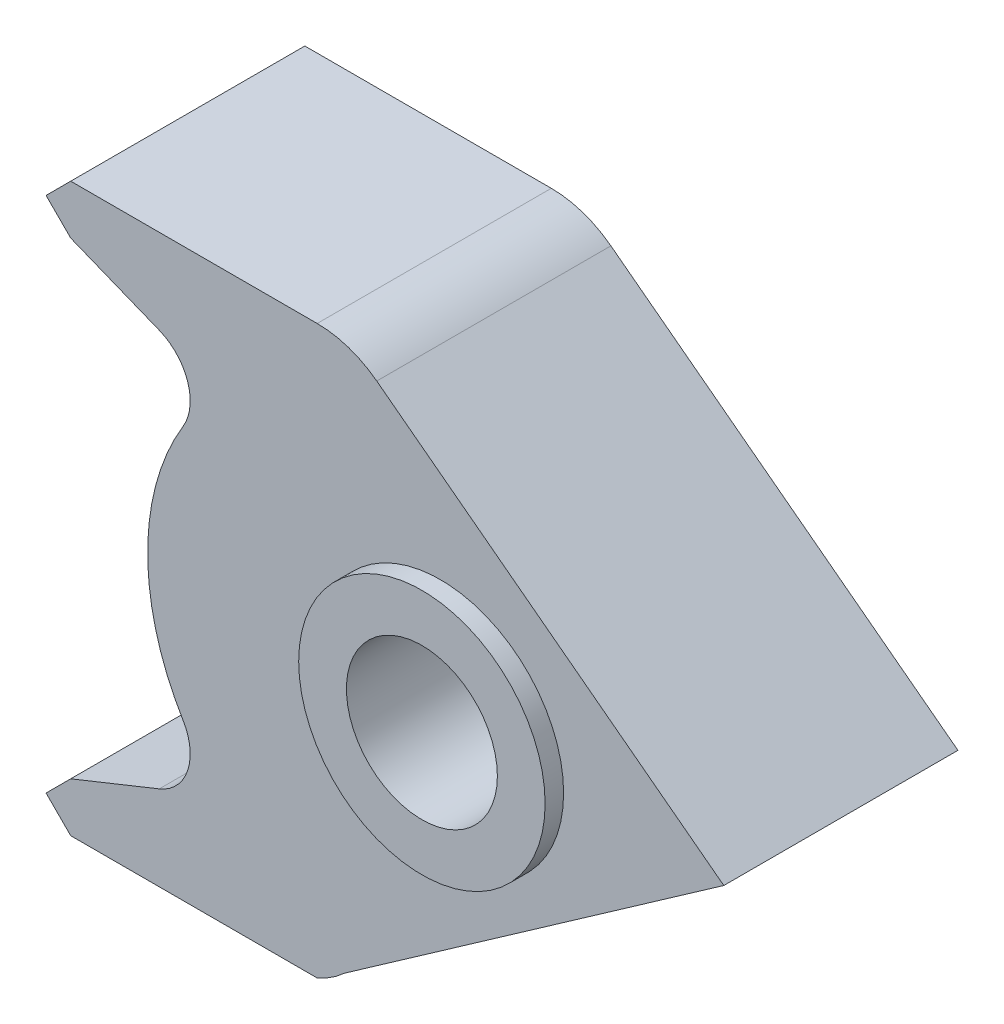
ISO-10303-21;
HEADER;
FILE_DESCRIPTION(('STEP AP214'),'2;1');
FILE_NAME('part.step','',(''),(''),'','','');
FILE_SCHEMA(('AUTOMOTIVE_DESIGN { 1 0 10303 214 1 1 1 1 }'));
ENDSEC;
DATA;
#1=APPLICATION_CONTEXT('core data for automotive mechanical design processes');
#2=APPLICATION_PROTOCOL_DEFINITION('international standard','automotive_design',2000,#1);
#3=PRODUCT_CONTEXT('',#1,'mechanical');
#4=PRODUCT('Part','Part','',(#3));
#5=PRODUCT_RELATED_PRODUCT_CATEGORY('part','',(#4));
#6=PRODUCT_DEFINITION_FORMATION('','',#4);
#7=PRODUCT_DEFINITION_CONTEXT('part definition',#1,'design');
#8=PRODUCT_DEFINITION('design','',#6,#7);
#9=PRODUCT_DEFINITION_SHAPE('','',#8);
#10=(LENGTH_UNIT() NAMED_UNIT(*) SI_UNIT(.MILLI.,.METRE.));
#11=(NAMED_UNIT(*) PLANE_ANGLE_UNIT() SI_UNIT($,.RADIAN.));
#12=(NAMED_UNIT(*) SI_UNIT($,.STERADIAN.) SOLID_ANGLE_UNIT());
#13=UNCERTAINTY_MEASURE_WITH_UNIT(LENGTH_MEASURE(1.E-05),#10,'distance_accuracy_value','');
#14=(GEOMETRIC_REPRESENTATION_CONTEXT(3) GLOBAL_UNCERTAINTY_ASSIGNED_CONTEXT((#13)) GLOBAL_UNIT_ASSIGNED_CONTEXT((#10,
#11,#12)) REPRESENTATION_CONTEXT('',''));
#15=CARTESIAN_POINT('',(0.,0.,0.));
#16=DIRECTION('',(0.,0.,1.));
#17=DIRECTION('',(1.,0.,0.));
#18=AXIS2_PLACEMENT_3D('',#15,#16,#17);
#19=CARTESIAN_POINT('',(-36.1998640392145,-15.6678195514197,22.));
#20=DIRECTION('',(0.,0.,-1.));
#21=DIRECTION('',(-1.,0.,0.));
#22=AXIS2_PLACEMENT_3D('',#19,#20,#21);
#23=CYLINDRICAL_SURFACE('',#22,8.00000000000001);
#24=DIRECTION('',(0.,0.,-1.));
#25=VECTOR('',#24,1.);
#26=CARTESIAN_POINT('',(-33.,-23.,22.));
#27=LINE('',#26,#25);
#28=CARTESIAN_POINT('',(-33.,-23.,20.5));
#29=VERTEX_POINT('',#28);
#30=CARTESIAN_POINT('',(-33.,-23.,1.5));
#31=VERTEX_POINT('',#30);
#32=EDGE_CURVE('E159',#29,#31,#27,.T.);
#33=ORIENTED_EDGE('',*,*,#32,.T.);
#34=CARTESIAN_POINT('',(-36.1998640392145,-15.6678195514197,1.5));
#35=DIRECTION('',(0.,0.,-1.));
#36=DIRECTION('',(-1.,0.,0.));
#37=AXIS2_PLACEMENT_3D('',#34,#35,#36);
#38=CIRCLE('',#37,8.00000000000001);
#39=CARTESIAN_POINT('',(-30.7811829752925,-21.5532163543119,1.5));
#40=VERTEX_POINT('',#39);
#41=EDGE_CURVE('E51',#31,#40,#38,.F.);
#42=ORIENTED_EDGE('',*,*,#41,.T.);
#43=DIRECTION('',(0.,0.,-1.));
#44=VECTOR('',#43,1.);
#45=CARTESIAN_POINT('',(-30.7811829752925,-21.5532163543119,22.));
#46=LINE('',#45,#44);
#47=CARTESIAN_POINT('',(-30.7811829752925,-21.5532163543119,20.5));
#48=VERTEX_POINT('',#47);
#49=EDGE_CURVE('E199',#48,#40,#46,.T.);
#50=ORIENTED_EDGE('',*,*,#49,.F.);
#51=CARTESIAN_POINT('',(-36.1998640392145,-15.6678195514197,20.5));
#52=DIRECTION('',(0.,0.,1.));
#53=DIRECTION('',(1.,0.,0.));
#54=AXIS2_PLACEMENT_3D('',#51,#52,#53);
#55=CIRCLE('',#54,8.00000000000001);
#56=EDGE_CURVE('E211',#48,#29,#55,.F.);
#57=ORIENTED_EDGE('',*,*,#56,.T.);
#58=EDGE_LOOP('',(#33,#42,#50,#57));
#59=FACE_BOUND('',#58,.T.);
#60=ADVANCED_FACE('F37',(#59),#23,.T.);
#61=CARTESIAN_POINT('',(0.,0.,22.));
#62=DIRECTION('',(0.573576436351041,-0.819152044288995,0.));
#63=DIRECTION('',(0.819152044288995,0.573576436351041,0.));
#64=AXIS2_PLACEMENT_3D('',#61,#62,#63);
#65=PLANE('',#64);
#66=ORIENTED_EDGE('',*,*,#49,.T.);
#67=DIRECTION('',(0.819152044288995,0.573576436351041,0.));
#68=VECTOR('',#67,1.);
#69=CARTESIAN_POINT('',(0.,0.,1.5));
#70=LINE('',#69,#68);
#71=CARTESIAN_POINT('',(0.,0.,1.5));
#72=VERTEX_POINT('',#71);
#73=EDGE_CURVE('E207',#40,#72,#70,.T.);
#74=ORIENTED_EDGE('',*,*,#73,.T.);
#75=DIRECTION('',(0.,0.,-1.));
#76=VECTOR('',#75,1.);
#77=CARTESIAN_POINT('',(0.,0.,22.));
#78=LINE('',#77,#76);
#79=CARTESIAN_POINT('',(0.,0.,20.5));
#80=VERTEX_POINT('',#79);
#81=EDGE_CURVE('E196',#80,#72,#78,.T.);
#82=ORIENTED_EDGE('',*,*,#81,.F.);
#83=DIRECTION('',(-0.819152044288995,-0.573576436351041,0.));
#84=VECTOR('',#83,1.);
#85=CARTESIAN_POINT('',(0.,0.,20.5));
#86=LINE('',#85,#84);
#87=EDGE_CURVE('E208',#80,#48,#86,.T.);
#88=ORIENTED_EDGE('',*,*,#87,.T.);
#89=EDGE_LOOP('',(#66,#74,#82,#88));
#90=FACE_BOUND('',#89,.T.);
#91=ADVANCED_FACE('F205',(#90),#65,.T.);
#92=CARTESIAN_POINT('',(0.,0.,22.));
#93=DIRECTION('',(-0.604513002960358,-0.796595273179455,0.));
#94=DIRECTION('',(0.796595273179455,-0.604513002960358,0.));
#95=AXIS2_PLACEMENT_3D('',#92,#93,#94);
#96=PLANE('',#95);
#97=DIRECTION('',(0.796595273179455,-0.604513002960358,0.));
#98=VECTOR('',#97,1.);
#99=CARTESIAN_POINT('',(0.,0.,1.5));
#100=LINE('',#99,#98);
#101=CARTESIAN_POINT('',(-28.1638959763172,21.3727621854356,1.5));
#102=VERTEX_POINT('',#101);
#103=EDGE_CURVE('E217',#102,#72,#100,.T.);
#104=ORIENTED_EDGE('',*,*,#103,.F.);
#105=DIRECTION('',(0.,0.,-1.));
#106=VECTOR('',#105,1.);
#107=CARTESIAN_POINT('',(-28.1638959763172,21.3727621854356,22.));
#108=LINE('',#107,#106);
#109=CARTESIAN_POINT('',(-28.1638959763172,21.3727621854356,20.5));
#110=VERTEX_POINT('',#109);
#111=EDGE_CURVE('E193',#110,#102,#108,.T.);
#112=ORIENTED_EDGE('',*,*,#111,.F.);
#113=DIRECTION('',(-0.796595273179455,0.604513002960358,0.));
#114=VECTOR('',#113,1.);
#115=CARTESIAN_POINT('',(0.,0.,20.5));
#116=LINE('',#115,#114);
#117=EDGE_CURVE('E247',#80,#110,#116,.T.);
#118=ORIENTED_EDGE('',*,*,#117,.F.);
#119=ORIENTED_EDGE('',*,*,#81,.T.);
#120=EDGE_LOOP('',(#104,#112,#118,#119));
#121=FACE_BOUND('',#120,.T.);
#122=ADVANCED_FACE('F279',(#121),#96,.F.);
#123=CARTESIAN_POINT('',(-33.,15.,22.));
#124=DIRECTION('',(0.,0.,-1.));
#125=DIRECTION('',(-1.,0.,0.));
#126=AXIS2_PLACEMENT_3D('',#123,#124,#125);
#127=CYLINDRICAL_SURFACE('',#126,8.);
#128=CARTESIAN_POINT('',(-33.,15.,1.5));
#129=DIRECTION('',(0.,0.,-1.));
#130=DIRECTION('',(-1.,0.,0.));
#131=AXIS2_PLACEMENT_3D('',#128,#129,#130);
#132=CIRCLE('',#131,8.);
#133=CARTESIAN_POINT('',(-33.,23.,1.5));
#134=VERTEX_POINT('',#133);
#135=EDGE_CURVE('E372',#134,#102,#132,.T.);
#136=ORIENTED_EDGE('',*,*,#135,.F.);
#137=DIRECTION('',(0.,0.,-1.));
#138=VECTOR('',#137,1.);
#139=CARTESIAN_POINT('',(-33.,23.,22.));
#140=LINE('',#139,#138);
#141=CARTESIAN_POINT('',(-33.,23.,20.5));
#142=VERTEX_POINT('',#141);
#143=EDGE_CURVE('E190',#142,#134,#140,.T.);
#144=ORIENTED_EDGE('',*,*,#143,.F.);
#145=CARTESIAN_POINT('',(-33.,15.,20.5));
#146=DIRECTION('',(0.,0.,1.));
#147=DIRECTION('',(1.,0.,0.));
#148=AXIS2_PLACEMENT_3D('',#145,#146,#147);
#149=CIRCLE('',#148,8.);
#150=EDGE_CURVE('E245',#110,#142,#149,.T.);
#151=ORIENTED_EDGE('',*,*,#150,.F.);
#152=ORIENTED_EDGE('',*,*,#111,.T.);
#153=EDGE_LOOP('',(#136,#144,#151,#152));
#154=FACE_BOUND('',#153,.T.);
#155=ADVANCED_FACE('F283',(#154),#127,.T.);
#156=CARTESIAN_POINT('',(0.,23.,22.));
#157=DIRECTION('',(0.,-1.,0.));
#158=DIRECTION('',(0.,0.,-1.));
#159=AXIS2_PLACEMENT_3D('',#156,#157,#158);
#160=PLANE('',#159);
#161=DIRECTION('',(1.,0.,0.));
#162=VECTOR('',#161,1.);
#163=CARTESIAN_POINT('',(0.,23.,1.5));
#164=LINE('',#163,#162);
#165=CARTESIAN_POINT('',(-53.,23.,1.5));
#166=VERTEX_POINT('',#165);
#167=EDGE_CURVE('E370',#166,#134,#164,.T.);
#168=ORIENTED_EDGE('',*,*,#167,.F.);
#169=DIRECTION('',(0.,0.,-1.));
#170=VECTOR('',#169,1.);
#171=CARTESIAN_POINT('',(-53.,23.,22.));
#172=LINE('',#171,#170);
#173=CARTESIAN_POINT('',(-53.,23.,20.5));
#174=VERTEX_POINT('',#173);
#175=EDGE_CURVE('E187',#174,#166,#172,.T.);
#176=ORIENTED_EDGE('',*,*,#175,.F.);
#177=DIRECTION('',(-1.,0.,0.));
#178=VECTOR('',#177,1.);
#179=CARTESIAN_POINT('',(0.,23.,20.5));
#180=LINE('',#179,#178);
#181=EDGE_CURVE('E243',#142,#174,#180,.T.);
#182=ORIENTED_EDGE('',*,*,#181,.F.);
#183=ORIENTED_EDGE('',*,*,#143,.T.);
#184=EDGE_LOOP('',(#168,#176,#182,#183));
#185=FACE_BOUND('',#184,.T.);
#186=ADVANCED_FACE('F289',(#185),#160,.F.);
#187=CARTESIAN_POINT('',(-38.0000000000003,37.9999999999999,22.));
#188=DIRECTION('',(0.707106781186552,-0.707106781186543,0.));
#189=DIRECTION('',(0.707106781186543,0.707106781186552,0.));
#190=AXIS2_PLACEMENT_3D('',#187,#188,#189);
#191=PLANE('',#190);
#192=DIRECTION('',(0.707106781186543,0.707106781186552,0.));
#193=VECTOR('',#192,1.);
#194=CARTESIAN_POINT('',(-38.0000000000003,37.9999999999999,1.5));
#195=LINE('',#194,#193);
#196=CARTESIAN_POINT('',(-55.,21.,1.5));
#197=VERTEX_POINT('',#196);
#198=EDGE_CURVE('E368',#197,#166,#195,.T.);
#199=ORIENTED_EDGE('',*,*,#198,.F.);
#200=DIRECTION('',(0.,0.,-1.));
#201=VECTOR('',#200,1.);
#202=CARTESIAN_POINT('',(-55.,21.,22.));
#203=LINE('',#202,#201);
#204=CARTESIAN_POINT('',(-55.,21.,20.5));
#205=VERTEX_POINT('',#204);
#206=EDGE_CURVE('E184',#205,#197,#203,.T.);
#207=ORIENTED_EDGE('',*,*,#206,.F.);
#208=DIRECTION('',(-0.707106781186543,-0.707106781186552,0.));
#209=VECTOR('',#208,1.);
#210=CARTESIAN_POINT('',(-38.0000000000003,37.9999999999999,20.5));
#211=LINE('',#210,#209);
#212=EDGE_CURVE('E241',#174,#205,#211,.T.);
#213=ORIENTED_EDGE('',*,*,#212,.F.);
#214=ORIENTED_EDGE('',*,*,#175,.T.);
#215=EDGE_LOOP('',(#199,#207,#213,#214));
#216=FACE_BOUND('',#215,.T.);
#217=ADVANCED_FACE('F293',(#216),#191,.F.);
#218=CARTESIAN_POINT('',(-17.0000000000003,-17.0000000000001,22.));
#219=DIRECTION('',(0.707106781186551,0.707106781186544,0.));
#220=DIRECTION('',(-0.707106781186544,0.707106781186551,0.));
#221=AXIS2_PLACEMENT_3D('',#218,#219,#220);
#222=PLANE('',#221);
#223=DIRECTION('',(-0.707106781186544,0.707106781186551,0.));
#224=VECTOR('',#223,1.);
#225=CARTESIAN_POINT('',(-17.0000000000003,-17.0000000000001,1.5));
#226=LINE('',#225,#224);
#227=CARTESIAN_POINT('',(-53.,19.,1.5));
#228=VERTEX_POINT('',#227);
#229=EDGE_CURVE('E366',#228,#197,#226,.T.);
#230=ORIENTED_EDGE('',*,*,#229,.F.);
#231=DIRECTION('',(0.,0.,-1.));
#232=VECTOR('',#231,1.);
#233=CARTESIAN_POINT('',(-53.,19.,22.));
#234=LINE('',#233,#232);
#235=CARTESIAN_POINT('',(-53.,19.,20.5));
#236=VERTEX_POINT('',#235);
#237=EDGE_CURVE('E181',#236,#228,#234,.T.);
#238=ORIENTED_EDGE('',*,*,#237,.F.);
#239=DIRECTION('',(0.707106781186544,-0.707106781186551,0.));
#240=VECTOR('',#239,1.);
#241=CARTESIAN_POINT('',(-17.0000000000003,-17.0000000000001,20.5));
#242=LINE('',#241,#240);
#243=EDGE_CURVE('E239',#205,#236,#242,.T.);
#244=ORIENTED_EDGE('',*,*,#243,.F.);
#245=ORIENTED_EDGE('',*,*,#206,.T.);
#246=EDGE_LOOP('',(#230,#238,#244,#245));
#247=FACE_BOUND('',#246,.T.);
#248=ADVANCED_FACE('F297',(#247),#222,.F.);
#249=CARTESIAN_POINT('',(-0.785958200146666,-1.95809994350702,22.));
#250=DIRECTION('',(0.372501003972312,0.928031789347552,0.));
#251=DIRECTION('',(-0.928031789347552,0.372501003972312,0.));
#252=AXIS2_PLACEMENT_3D('',#249,#250,#251);
#253=PLANE('',#252);
#254=DIRECTION('',(-0.928031789347552,0.372501003972312,0.));
#255=VECTOR('',#254,1.);
#256=CARTESIAN_POINT('',(-0.785958200146666,-1.95809994350702,1.5));
#257=LINE('',#256,#255);
#258=CARTESIAN_POINT('',(-45.8120439016806,16.1148392825906,1.5));
#259=VERTEX_POINT('',#258);
#260=EDGE_CURVE('E364',#259,#228,#257,.T.);
#261=ORIENTED_EDGE('',*,*,#260,.F.);
#262=DIRECTION('',(0.,0.,-1.));
#263=VECTOR('',#262,1.);
#264=CARTESIAN_POINT('',(-45.8120439016806,16.1148392825904,22.));
#265=LINE('',#264,#263);
#266=CARTESIAN_POINT('',(-45.8120439016806,16.1148392825906,20.5));
#267=VERTEX_POINT('',#266);
#268=EDGE_CURVE('E178',#267,#259,#265,.T.);
#269=ORIENTED_EDGE('',*,*,#268,.F.);
#270=DIRECTION('',(0.928031789347552,-0.372501003972312,0.));
#271=VECTOR('',#270,1.);
#272=CARTESIAN_POINT('',(-0.785958200146666,-1.95809994350702,20.5));
#273=LINE('',#272,#271);
#274=EDGE_CURVE('E237',#236,#267,#273,.T.);
#275=ORIENTED_EDGE('',*,*,#274,.F.);
#276=ORIENTED_EDGE('',*,*,#237,.T.);
#277=EDGE_LOOP('',(#261,#269,#275,#276));
#278=FACE_BOUND('',#277,.T.);
#279=ADVANCED_FACE('F301',(#278),#253,.F.);
#280=CARTESIAN_POINT('',(-47.3020479175699,12.4027121252004,22.));
#281=DIRECTION('',(0.,0.,-1.));
#282=DIRECTION('',(-1.,0.,0.));
#283=AXIS2_PLACEMENT_3D('',#280,#281,#282);
#284=CYLINDRICAL_SURFACE('',#283,3.99999999999996);
#285=CARTESIAN_POINT('',(-47.3020479175699,12.4027121252004,1.5));
#286=DIRECTION('',(0.,0.,-1.));
#287=DIRECTION('',(-1.,0.,0.));
#288=AXIS2_PLACEMENT_3D('',#285,#286,#287);
#289=CIRCLE('',#288,3.99999999999996);
#290=CARTESIAN_POINT('',(-43.8775741869582,10.3355934376668,1.5));
#291=VERTEX_POINT('',#290);
#292=EDGE_CURVE('E362',#291,#259,#289,.F.);
#293=ORIENTED_EDGE('',*,*,#292,.F.);
#294=DIRECTION('',(0.,0.,-1.));
#295=VECTOR('',#294,1.);
#296=CARTESIAN_POINT('',(-43.8775741869582,10.3355934376668,22.));
#297=LINE('',#296,#295);
#298=CARTESIAN_POINT('',(-43.8775741869582,10.3355934376668,20.5));
#299=VERTEX_POINT('',#298);
#300=EDGE_CURVE('E175',#299,#291,#297,.T.);
#301=ORIENTED_EDGE('',*,*,#300,.F.);
#302=CARTESIAN_POINT('',(-47.3020479175699,12.4027121252004,20.5));
#303=DIRECTION('',(0.,0.,1.));
#304=DIRECTION('',(1.,0.,0.));
#305=AXIS2_PLACEMENT_3D('',#302,#303,#304);
#306=CIRCLE('',#305,3.99999999999996);
#307=EDGE_CURVE('E235',#267,#299,#306,.F.);
#308=ORIENTED_EDGE('',*,*,#307,.F.);
#309=ORIENTED_EDGE('',*,*,#268,.T.);
#310=EDGE_LOOP('',(#293,#301,#308,#309));
#311=FACE_BOUND('',#310,.T.);
#312=ADVANCED_FACE('F305',(#311),#284,.F.);
#313=CARTESIAN_POINT('',(-26.7552055338993,-1.92777046786653E-13,22.));
#314=DIRECTION('',(0.,0.,-1.));
#315=DIRECTION('',(-1.,0.,0.));
#316=AXIS2_PLACEMENT_3D('',#313,#314,#315);
#317=CYLINDRICAL_SURFACE('',#316,20.);
#318=CARTESIAN_POINT('',(-26.7552055338993,-1.92777046786653E-13,1.5));
#319=DIRECTION('',(0.,0.,-1.));
#320=DIRECTION('',(-1.,0.,0.));
#321=AXIS2_PLACEMENT_3D('',#318,#319,#320);
#322=CIRCLE('',#321,20.);
#323=CARTESIAN_POINT('',(-43.8775741869583,-10.3355934376671,1.5));
#324=VERTEX_POINT('',#323);
#325=EDGE_CURVE('E360',#324,#291,#322,.T.);
#326=ORIENTED_EDGE('',*,*,#325,.F.);
#327=DIRECTION('',(0.,0.,-1.));
#328=VECTOR('',#327,1.);
#329=CARTESIAN_POINT('',(-43.8775741869583,-10.3355934376671,22.));
#330=LINE('',#329,#328);
#331=CARTESIAN_POINT('',(-43.8775741869583,-10.3355934376671,20.5));
#332=VERTEX_POINT('',#331);
#333=EDGE_CURVE('E172',#332,#324,#330,.T.);
#334=ORIENTED_EDGE('',*,*,#333,.F.);
#335=CARTESIAN_POINT('',(-26.7552055338993,-1.92777046786653E-13,20.5));
#336=DIRECTION('',(0.,0.,1.));
#337=DIRECTION('',(1.,0.,0.));
#338=AXIS2_PLACEMENT_3D('',#335,#336,#337);
#339=CIRCLE('',#338,20.);
#340=EDGE_CURVE('E233',#299,#332,#339,.T.);
#341=ORIENTED_EDGE('',*,*,#340,.F.);
#342=ORIENTED_EDGE('',*,*,#300,.T.);
#343=EDGE_LOOP('',(#326,#334,#341,#342));
#344=FACE_BOUND('',#343,.T.);
#345=ADVANCED_FACE('F309',(#344),#317,.T.);
#346=CARTESIAN_POINT('',(-47.30204791757,-12.4027121252005,22.));
#347=DIRECTION('',(0.,0.,-1.));
#348=DIRECTION('',(-1.,0.,0.));
#349=AXIS2_PLACEMENT_3D('',#346,#347,#348);
#350=CYLINDRICAL_SURFACE('',#349,3.99999999999994);
#351=ORIENTED_EDGE('',*,*,#333,.T.);
#352=CARTESIAN_POINT('',(-47.30204791757,-12.4027121252005,1.5));
#353=DIRECTION('',(0.,0.,-1.));
#354=DIRECTION('',(-1.,0.,0.));
#355=AXIS2_PLACEMENT_3D('',#352,#353,#354);
#356=CIRCLE('',#355,3.99999999999994);
#357=CARTESIAN_POINT('',(-45.8120439016807,-16.1148392825907,1.5));
#358=VERTEX_POINT('',#357);
#359=EDGE_CURVE('E357',#324,#358,#356,.T.);
#360=ORIENTED_EDGE('',*,*,#359,.T.);
#361=DIRECTION('',(0.,0.,-1.));
#362=VECTOR('',#361,1.);
#363=CARTESIAN_POINT('',(-45.8120439016807,-16.1148392825907,22.));
#364=LINE('',#363,#362);
#365=CARTESIAN_POINT('',(-45.8120439016807,-16.1148392825907,20.5));
#366=VERTEX_POINT('',#365);
#367=EDGE_CURVE('E169',#366,#358,#364,.T.);
#368=ORIENTED_EDGE('',*,*,#367,.F.);
#369=CARTESIAN_POINT('',(-47.30204791757,-12.4027121252005,20.5));
#370=DIRECTION('',(0.,0.,1.));
#371=DIRECTION('',(1.,0.,0.));
#372=AXIS2_PLACEMENT_3D('',#369,#370,#371);
#373=CIRCLE('',#372,3.99999999999994);
#374=EDGE_CURVE('E230',#366,#332,#373,.T.);
#375=ORIENTED_EDGE('',*,*,#374,.T.);
#376=EDGE_LOOP('',(#351,#360,#368,#375));
#377=FACE_BOUND('',#376,.T.);
#378=ADVANCED_FACE('F313',(#377),#350,.F.);
#379=CARTESIAN_POINT('',(-0.785958200145961,1.95809994350544,22.));
#380=DIRECTION('',(-0.372501003972284,0.928031789347564,0.));
#381=DIRECTION('',(-0.928031789347564,-0.372501003972284,0.));
#382=AXIS2_PLACEMENT_3D('',#379,#380,#381);
#383=PLANE('',#382);
#384=ORIENTED_EDGE('',*,*,#367,.T.);
#385=DIRECTION('',(-0.928031789347564,-0.372501003972284,0.));
#386=VECTOR('',#385,1.);
#387=CARTESIAN_POINT('',(-0.785958200145961,1.95809994350544,1.5));
#388=LINE('',#387,#386);
#389=CARTESIAN_POINT('',(-53.,-19.,1.5));
#390=VERTEX_POINT('',#389);
#391=EDGE_CURVE('E354',#358,#390,#388,.T.);
#392=ORIENTED_EDGE('',*,*,#391,.T.);
#393=DIRECTION('',(0.,0.,-1.));
#394=VECTOR('',#393,1.);
#395=CARTESIAN_POINT('',(-53.,-19.,22.));
#396=LINE('',#395,#394);
#397=CARTESIAN_POINT('',(-53.,-19.,20.5));
#398=VERTEX_POINT('',#397);
#399=EDGE_CURVE('E161',#398,#390,#396,.T.);
#400=ORIENTED_EDGE('',*,*,#399,.F.);
#401=DIRECTION('',(0.928031789347564,0.372501003972284,0.));
#402=VECTOR('',#401,1.);
#403=CARTESIAN_POINT('',(-0.785958200145961,1.95809994350544,20.5));
#404=LINE('',#403,#402);
#405=EDGE_CURVE('E227',#398,#366,#404,.T.);
#406=ORIENTED_EDGE('',*,*,#405,.T.);
#407=EDGE_LOOP('',(#384,#392,#400,#406));
#408=FACE_BOUND('',#407,.T.);
#409=ADVANCED_FACE('F317',(#408),#383,.T.);
#410=CARTESIAN_POINT('',(-17.,17.,22.));
#411=DIRECTION('',(-0.707106781186548,0.707106781186548,0.));
#412=DIRECTION('',(-0.707106781186548,-0.707106781186548,0.));
#413=AXIS2_PLACEMENT_3D('',#410,#411,#412);
#414=PLANE('',#413);
#415=ORIENTED_EDGE('',*,*,#399,.T.);
#416=DIRECTION('',(-0.707106781186548,-0.707106781186548,0.));
#417=VECTOR('',#416,1.);
#418=CARTESIAN_POINT('',(-17.,17.,1.5));
#419=LINE('',#418,#417);
#420=CARTESIAN_POINT('',(-55.,-21.,1.5));
#421=VERTEX_POINT('',#420);
#422=EDGE_CURVE('E155',#390,#421,#419,.T.);
#423=ORIENTED_EDGE('',*,*,#422,.T.);
#424=DIRECTION('',(0.,0.,-1.));
#425=VECTOR('',#424,1.);
#426=CARTESIAN_POINT('',(-55.,-21.,22.));
#427=LINE('',#426,#425);
#428=CARTESIAN_POINT('',(-55.,-21.,20.5));
#429=VERTEX_POINT('',#428);
#430=EDGE_CURVE('E154',#429,#421,#427,.T.);
#431=ORIENTED_EDGE('',*,*,#430,.F.);
#432=DIRECTION('',(0.707106781186548,0.707106781186548,0.));
#433=VECTOR('',#432,1.);
#434=CARTESIAN_POINT('',(-17.,17.,20.5));
#435=LINE('',#434,#433);
#436=EDGE_CURVE('E224',#429,#398,#435,.T.);
#437=ORIENTED_EDGE('',*,*,#436,.T.);
#438=EDGE_LOOP('',(#415,#423,#431,#437));
#439=FACE_BOUND('',#438,.T.);
#440=ADVANCED_FACE('F321',(#439),#414,.T.);
#441=CARTESIAN_POINT('',(-38.,-38.,22.));
#442=DIRECTION('',(-0.707106781186548,-0.707106781186547,0.));
#443=DIRECTION('',(0.707106781186547,-0.707106781186548,0.));
#444=AXIS2_PLACEMENT_3D('',#441,#442,#443);
#445=PLANE('',#444);
#446=ORIENTED_EDGE('',*,*,#430,.T.);
#447=DIRECTION('',(0.707106781186547,-0.707106781186548,0.));
#448=VECTOR('',#447,1.);
#449=CARTESIAN_POINT('',(-38.,-38.,1.5));
#450=LINE('',#449,#448);
#451=CARTESIAN_POINT('',(-53.,-23.,1.5));
#452=VERTEX_POINT('',#451);
#453=EDGE_CURVE('E142',#421,#452,#450,.T.);
#454=ORIENTED_EDGE('',*,*,#453,.T.);
#455=DIRECTION('',(0.,0.,-1.));
#456=VECTOR('',#455,1.);
#457=CARTESIAN_POINT('',(-53.,-23.,22.));
#458=LINE('',#457,#456);
#459=CARTESIAN_POINT('',(-53.,-23.,20.5));
#460=VERTEX_POINT('',#459);
#461=EDGE_CURVE('E152',#460,#452,#458,.T.);
#462=ORIENTED_EDGE('',*,*,#461,.F.);
#463=DIRECTION('',(-0.707106781186547,0.707106781186548,0.));
#464=VECTOR('',#463,1.);
#465=CARTESIAN_POINT('',(-38.,-38.,20.5));
#466=LINE('',#465,#464);
#467=EDGE_CURVE('E58',#460,#429,#466,.T.);
#468=ORIENTED_EDGE('',*,*,#467,.T.);
#469=EDGE_LOOP('',(#446,#454,#462,#468));
#470=FACE_BOUND('',#469,.T.);
#471=ADVANCED_FACE('F151',(#470),#445,.T.);
#472=CARTESIAN_POINT('',(0.,-23.,22.));
#473=DIRECTION('',(0.,-1.,0.));
#474=DIRECTION('',(1.,0.,0.));
#475=AXIS2_PLACEMENT_3D('',#472,#473,#474);
#476=PLANE('',#475);
#477=ORIENTED_EDGE('',*,*,#461,.T.);
#478=DIRECTION('',(1.,0.,0.));
#479=VECTOR('',#478,1.);
#480=CARTESIAN_POINT('',(0.,-23.,1.5));
#481=LINE('',#480,#479);
#482=EDGE_CURVE('E12',#452,#31,#481,.T.);
#483=ORIENTED_EDGE('',*,*,#482,.T.);
#484=ORIENTED_EDGE('',*,*,#32,.F.);
#485=DIRECTION('',(-1.,0.,0.));
#486=VECTOR('',#485,1.);
#487=CARTESIAN_POINT('',(0.,-23.,20.5));
#488=LINE('',#487,#486);
#489=EDGE_CURVE('E44',#29,#460,#488,.T.);
#490=ORIENTED_EDGE('',*,*,#489,.T.);
#491=EDGE_LOOP('',(#477,#483,#484,#490));
#492=FACE_BOUND('',#491,.T.);
#493=ADVANCED_FACE('F158',(#492),#476,.T.);
#494=CARTESIAN_POINT('',(0.,0.,0.));
#495=DIRECTION('',(0.,0.,1.));
#496=DIRECTION('',(1.,0.,0.));
#497=AXIS2_PLACEMENT_3D('',#494,#495,#496);
#498=PLANE('',#497);
#499=CARTESIAN_POINT('',(-23.,0.,0.));
#500=DIRECTION('',(0.,0.,1.));
#501=DIRECTION('',(1.,0.,0.));
#502=AXIS2_PLACEMENT_3D('',#499,#500,#501);
#503=CIRCLE('',#502,6.125);
#504=CARTESIAN_POINT('',(-16.875,0.,0.));
#505=VERTEX_POINT('',#504);
#506=EDGE_CURVE('E251',#505,#505,#503,.T.);
#507=ORIENTED_EDGE('',*,*,#506,.T.);
#508=EDGE_LOOP('',(#507));
#509=FACE_BOUND('',#508,.T.);
#510=CARTESIAN_POINT('',(-23.,0.,0.));
#511=DIRECTION('',(0.,0.,-1.));
#512=DIRECTION('',(-1.,0.,0.));
#513=AXIS2_PLACEMENT_3D('',#510,#511,#512);
#514=CIRCLE('',#513,10.);
#515=CARTESIAN_POINT('',(-33.,0.,0.));
#516=VERTEX_POINT('',#515);
#517=EDGE_CURVE('E349',#516,#516,#514,.T.);
#518=ORIENTED_EDGE('',*,*,#517,.T.);
#519=EDGE_LOOP('',(#518));
#520=FACE_BOUND('',#519,.T.);
#521=ADVANCED_FACE('F256',(#509,#520),#498,.F.);
#522=CARTESIAN_POINT('',(0.,0.,22.));
#523=DIRECTION('',(0.,0.,1.));
#524=DIRECTION('',(1.,0.,0.));
#525=AXIS2_PLACEMENT_3D('',#522,#523,#524);
#526=PLANE('',#525);
#527=CARTESIAN_POINT('',(-23.,0.,22.));
#528=DIRECTION('',(0.,0.,1.));
#529=DIRECTION('',(1.,0.,0.));
#530=AXIS2_PLACEMENT_3D('',#527,#528,#529);
#531=CIRCLE('',#530,6.125);
#532=CARTESIAN_POINT('',(-16.875,0.,22.));
#533=VERTEX_POINT('',#532);
#534=EDGE_CURVE('E163',#533,#533,#531,.T.);
#535=ORIENTED_EDGE('',*,*,#534,.F.);
#536=EDGE_LOOP('',(#535));
#537=FACE_BOUND('',#536,.T.);
#538=CARTESIAN_POINT('',(-23.,0.,22.));
#539=DIRECTION('',(0.,0.,1.));
#540=DIRECTION('',(1.,0.,0.));
#541=AXIS2_PLACEMENT_3D('',#538,#539,#540);
#542=CIRCLE('',#541,10.);
#543=CARTESIAN_POINT('',(-13.,0.,22.));
#544=VERTEX_POINT('',#543);
#545=EDGE_CURVE('E212',#544,#544,#542,.T.);
#546=ORIENTED_EDGE('',*,*,#545,.T.);
#547=EDGE_LOOP('',(#546));
#548=FACE_BOUND('',#547,.T.);
#549=ADVANCED_FACE('F262',(#537,#548),#526,.T.);
#550=CARTESIAN_POINT('',(-23.,0.,22.));
#551=DIRECTION('',(0.,0.,-1.));
#552=DIRECTION('',(-1.,0.,0.));
#553=AXIS2_PLACEMENT_3D('',#550,#551,#552);
#554=CYLINDRICAL_SURFACE('',#553,6.125);
#555=ORIENTED_EDGE('',*,*,#534,.T.);
#556=EDGE_LOOP('',(#555));
#557=FACE_BOUND('',#556,.T.);
#558=ORIENTED_EDGE('',*,*,#506,.F.);
#559=EDGE_LOOP('',(#558));
#560=FACE_BOUND('',#559,.T.);
#561=ADVANCED_FACE('F259',(#557,#560),#554,.F.);
#562=CARTESIAN_POINT('',(-27.5,0.,20.5));
#563=DIRECTION('',(0.,0.,1.));
#564=DIRECTION('',(1.,0.,0.));
#565=AXIS2_PLACEMENT_3D('',#562,#563,#564);
#566=PLANE('',#565);
#567=ORIENTED_EDGE('',*,*,#87,.F.);
#568=ORIENTED_EDGE('',*,*,#117,.T.);
#569=ORIENTED_EDGE('',*,*,#150,.T.);
#570=ORIENTED_EDGE('',*,*,#181,.T.);
#571=ORIENTED_EDGE('',*,*,#212,.T.);
#572=ORIENTED_EDGE('',*,*,#243,.T.);
#573=ORIENTED_EDGE('',*,*,#274,.T.);
#574=ORIENTED_EDGE('',*,*,#307,.T.);
#575=ORIENTED_EDGE('',*,*,#340,.T.);
#576=ORIENTED_EDGE('',*,*,#374,.F.);
#577=ORIENTED_EDGE('',*,*,#405,.F.);
#578=ORIENTED_EDGE('',*,*,#436,.F.);
#579=ORIENTED_EDGE('',*,*,#467,.F.);
#580=ORIENTED_EDGE('',*,*,#489,.F.);
#581=ORIENTED_EDGE('',*,*,#56,.F.);
#582=EDGE_LOOP('',(#567,#568,#569,#570,#571,#572,#573,#574,#575,#576,#577,#578,#579,#580,#581));
#583=FACE_BOUND('',#582,.T.);
#584=CARTESIAN_POINT('',(-23.,0.,20.5));
#585=DIRECTION('',(0.,0.,1.));
#586=DIRECTION('',(1.,0.,0.));
#587=AXIS2_PLACEMENT_3D('',#584,#585,#586);
#588=CIRCLE('',#587,10.);
#589=CARTESIAN_POINT('',(-13.,0.,20.5));
#590=VERTEX_POINT('',#589);
#591=EDGE_CURVE('E215',#590,#590,#588,.T.);
#592=ORIENTED_EDGE('',*,*,#591,.F.);
#593=EDGE_LOOP('',(#592));
#594=FACE_BOUND('',#593,.T.);
#595=ADVANCED_FACE('F261',(#583,#594),#566,.T.);
#596=CARTESIAN_POINT('',(-23.,0.,20.5));
#597=DIRECTION('',(0.,0.,1.));
#598=DIRECTION('',(1.,0.,0.));
#599=AXIS2_PLACEMENT_3D('',#596,#597,#598);
#600=CYLINDRICAL_SURFACE('',#599,10.);
#601=ORIENTED_EDGE('',*,*,#591,.T.);
#602=EDGE_LOOP('',(#601));
#603=FACE_BOUND('',#602,.T.);
#604=ORIENTED_EDGE('',*,*,#545,.F.);
#605=EDGE_LOOP('',(#604));
#606=FACE_BOUND('',#605,.T.);
#607=ADVANCED_FACE('F269',(#603,#606),#600,.T.);
#608=CARTESIAN_POINT('',(-27.5,0.,1.5));
#609=DIRECTION('',(0.,0.,-1.));
#610=DIRECTION('',(-1.,0.,0.));
#611=AXIS2_PLACEMENT_3D('',#608,#609,#610);
#612=PLANE('',#611);
#613=ORIENTED_EDGE('',*,*,#482,.F.);
#614=ORIENTED_EDGE('',*,*,#453,.F.);
#615=ORIENTED_EDGE('',*,*,#422,.F.);
#616=ORIENTED_EDGE('',*,*,#391,.F.);
#617=ORIENTED_EDGE('',*,*,#359,.F.);
#618=ORIENTED_EDGE('',*,*,#325,.T.);
#619=ORIENTED_EDGE('',*,*,#292,.T.);
#620=ORIENTED_EDGE('',*,*,#260,.T.);
#621=ORIENTED_EDGE('',*,*,#229,.T.);
#622=ORIENTED_EDGE('',*,*,#198,.T.);
#623=ORIENTED_EDGE('',*,*,#167,.T.);
#624=ORIENTED_EDGE('',*,*,#135,.T.);
#625=ORIENTED_EDGE('',*,*,#103,.T.);
#626=ORIENTED_EDGE('',*,*,#73,.F.);
#627=ORIENTED_EDGE('',*,*,#41,.F.);
#628=EDGE_LOOP('',(#613,#614,#615,#616,#617,#618,#619,#620,#621,#622,#623,#624,#625,#626,#627));
#629=FACE_BOUND('',#628,.T.);
#630=CARTESIAN_POINT('',(-23.,0.,1.5));
#631=DIRECTION('',(0.,0.,-1.));
#632=DIRECTION('',(-1.,0.,0.));
#633=AXIS2_PLACEMENT_3D('',#630,#631,#632);
#634=CIRCLE('',#633,10.);
#635=CARTESIAN_POINT('',(-33.,0.,1.5));
#636=VERTEX_POINT('',#635);
#637=EDGE_CURVE('E156',#636,#636,#634,.T.);
#638=ORIENTED_EDGE('',*,*,#637,.F.);
#639=EDGE_LOOP('',(#638));
#640=FACE_BOUND('',#639,.T.);
#641=ADVANCED_FACE('F140',(#629,#640),#612,.T.);
#642=CARTESIAN_POINT('',(-23.,0.,1.5));
#643=DIRECTION('',(0.,0.,-1.));
#644=DIRECTION('',(-1.,0.,0.));
#645=AXIS2_PLACEMENT_3D('',#642,#643,#644);
#646=CYLINDRICAL_SURFACE('',#645,10.);
#647=ORIENTED_EDGE('',*,*,#637,.T.);
#648=EDGE_LOOP('',(#647));
#649=FACE_BOUND('',#648,.T.);
#650=ORIENTED_EDGE('',*,*,#517,.F.);
#651=EDGE_LOOP('',(#650));
#652=FACE_BOUND('',#651,.T.);
#653=ADVANCED_FACE('F339',(#649,#652),#646,.T.);
#654=CLOSED_SHELL('',(#60,#91,#122,#155,#186,#217,#248,#279,#312,#345,#378,#409,#440,#471,#493,
#521,#549,#561,#595,#607,#641,#653));
#655=MANIFOLD_SOLID_BREP('B2',#654);
#656=ADVANCED_BREP_SHAPE_REPRESENTATION('',(#18,#655),#14);
#657=SHAPE_DEFINITION_REPRESENTATION(#9,#656);
ENDSEC;
END-ISO-10303-21;
